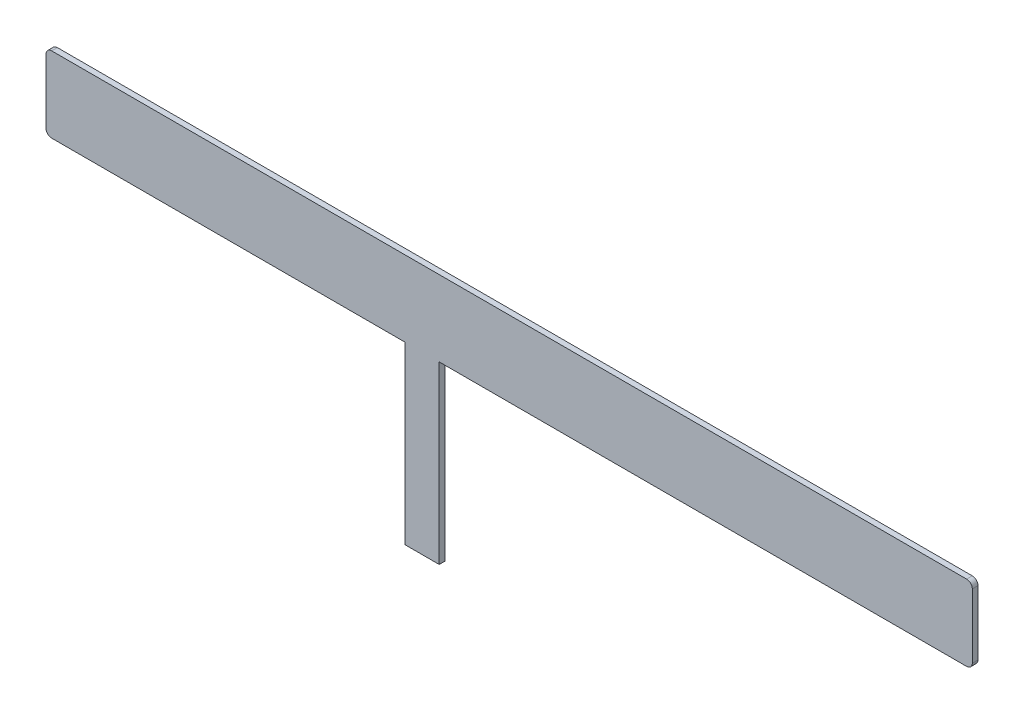
ISO-10303-21;
HEADER;
FILE_DESCRIPTION(('STEP AP214'),'2;1');
FILE_NAME('part.step','',(''),(''),'','','');
FILE_SCHEMA(('AUTOMOTIVE_DESIGN { 1 0 10303 214 1 1 1 1 }'));
ENDSEC;
DATA;
#1=APPLICATION_CONTEXT('core data for automotive mechanical design processes');
#2=APPLICATION_PROTOCOL_DEFINITION('international standard','automotive_design',2000,#1);
#3=PRODUCT_CONTEXT('',#1,'mechanical');
#4=PRODUCT('Part','Part','',(#3));
#5=PRODUCT_RELATED_PRODUCT_CATEGORY('part','',(#4));
#6=PRODUCT_DEFINITION_FORMATION('','',#4);
#7=PRODUCT_DEFINITION_CONTEXT('part definition',#1,'design');
#8=PRODUCT_DEFINITION('design','',#6,#7);
#9=PRODUCT_DEFINITION_SHAPE('','',#8);
#10=(LENGTH_UNIT() NAMED_UNIT(*) SI_UNIT(.MILLI.,.METRE.));
#11=(NAMED_UNIT(*) PLANE_ANGLE_UNIT() SI_UNIT($,.RADIAN.));
#12=(NAMED_UNIT(*) SI_UNIT($,.STERADIAN.) SOLID_ANGLE_UNIT());
#13=UNCERTAINTY_MEASURE_WITH_UNIT(LENGTH_MEASURE(1.E-05),#10,'distance_accuracy_value','');
#14=(GEOMETRIC_REPRESENTATION_CONTEXT(3) GLOBAL_UNCERTAINTY_ASSIGNED_CONTEXT((#13)) GLOBAL_UNIT_ASSIGNED_CONTEXT((#10,
#11,#12)) REPRESENTATION_CONTEXT('',''));
#15=CARTESIAN_POINT('',(0.,0.,0.));
#16=DIRECTION('',(0.,0.,1.));
#17=DIRECTION('',(1.,0.,0.));
#18=AXIS2_PLACEMENT_3D('',#15,#16,#17);
#19=CARTESIAN_POINT('',(21.8927669385197,5.50878863492785,0.3));
#20=DIRECTION('',(0.,-1.,0.));
#21=DIRECTION('',(1.,0.,0.));
#22=AXIS2_PLACEMENT_3D('',#19,#20,#21);
#23=PLANE('',#22);
#24=DIRECTION('',(-1.,0.,0.));
#25=VECTOR('',#24,1.);
#26=CARTESIAN_POINT('',(21.8927669385197,5.50878863492785,0.));
#27=LINE('',#26,#25);
#28=CARTESIAN_POINT('',(21.5927669385197,5.50878863492785,0.));
#29=VERTEX_POINT('',#28);
#30=CARTESIAN_POINT('',(-6.30723306148035,5.50878863492785,0.));
#31=VERTEX_POINT('',#30);
#32=EDGE_CURVE('E164',#29,#31,#27,.T.);
#33=ORIENTED_EDGE('',*,*,#32,.F.);
#34=DIRECTION('',(0.,0.,-1.));
#35=VECTOR('',#34,1.);
#36=CARTESIAN_POINT('',(21.5927669385197,5.50878863492785,0.3));
#37=LINE('',#36,#35);
#38=CARTESIAN_POINT('',(21.5927669385197,5.50878863492785,0.3));
#39=VERTEX_POINT('',#38);
#40=EDGE_CURVE('E132',#29,#39,#37,.F.);
#41=ORIENTED_EDGE('',*,*,#40,.T.);
#42=DIRECTION('',(-1.,0.,0.));
#43=VECTOR('',#42,1.);
#44=CARTESIAN_POINT('',(21.8927669385197,5.50878863492785,0.3));
#45=LINE('',#44,#43);
#46=CARTESIAN_POINT('',(-6.30723306148035,5.50878863492785,0.3));
#47=VERTEX_POINT('',#46);
#48=EDGE_CURVE('E126',#39,#47,#45,.T.);
#49=ORIENTED_EDGE('',*,*,#48,.T.);
#50=DIRECTION('',(0.,0.,-1.));
#51=VECTOR('',#50,1.);
#52=CARTESIAN_POINT('',(-6.30723306148035,5.50878863492785,0.3));
#53=LINE('',#52,#51);
#54=EDGE_CURVE('E129',#47,#31,#53,.T.);
#55=ORIENTED_EDGE('',*,*,#54,.T.);
#56=EDGE_LOOP('',(#33,#41,#49,#55));
#57=FACE_BOUND('',#56,.T.);
#58=ADVANCED_FACE('F37',(#57),#23,.T.);
#59=CARTESIAN_POINT('',(21.8927669385197,9.50878863492785,0.3));
#60=DIRECTION('',(1.,0.,0.));
#61=DIRECTION('',(0.,0.,-1.));
#62=AXIS2_PLACEMENT_3D('',#59,#60,#61);
#63=PLANE('',#62);
#64=DIRECTION('',(0.,-1.,0.));
#65=VECTOR('',#64,1.);
#66=CARTESIAN_POINT('',(21.8927669385197,9.50878863492785,0.3));
#67=LINE('',#66,#65);
#68=CARTESIAN_POINT('',(21.8927669385197,9.20878863492785,0.3));
#69=VERTEX_POINT('',#68);
#70=CARTESIAN_POINT('',(21.8927669385197,5.80878863492785,0.3));
#71=VERTEX_POINT('',#70);
#72=EDGE_CURVE('E144',#69,#71,#67,.T.);
#73=ORIENTED_EDGE('',*,*,#72,.T.);
#74=DIRECTION('',(0.,0.,-1.));
#75=VECTOR('',#74,1.);
#76=CARTESIAN_POINT('',(21.8927669385197,5.80878863492785,0.3));
#77=LINE('',#76,#75);
#78=CARTESIAN_POINT('',(21.8927669385197,5.80878863492785,0.));
#79=VERTEX_POINT('',#78);
#80=EDGE_CURVE('E190',#71,#79,#77,.T.);
#81=ORIENTED_EDGE('',*,*,#80,.T.);
#82=DIRECTION('',(0.,-1.,0.));
#83=VECTOR('',#82,1.);
#84=CARTESIAN_POINT('',(21.8927669385197,9.50878863492785,0.));
#85=LINE('',#84,#83);
#86=CARTESIAN_POINT('',(21.8927669385197,9.20878863492785,0.));
#87=VERTEX_POINT('',#86);
#88=EDGE_CURVE('E136',#87,#79,#85,.T.);
#89=ORIENTED_EDGE('',*,*,#88,.F.);
#90=DIRECTION('',(0.,0.,-1.));
#91=VECTOR('',#90,1.);
#92=CARTESIAN_POINT('',(21.8927669385197,9.20878863492785,0.3));
#93=LINE('',#92,#91);
#94=EDGE_CURVE('E184',#87,#69,#93,.F.);
#95=ORIENTED_EDGE('',*,*,#94,.T.);
#96=EDGE_LOOP('',(#73,#81,#89,#95));
#97=FACE_BOUND('',#96,.T.);
#98=ADVANCED_FACE('F246',(#97),#63,.T.);
#99=CARTESIAN_POINT('',(-27.1072330614803,9.50878863492785,0.3));
#100=DIRECTION('',(0.,1.,0.));
#101=DIRECTION('',(-1.,0.,0.));
#102=AXIS2_PLACEMENT_3D('',#99,#100,#101);
#103=PLANE('',#102);
#104=DIRECTION('',(1.,0.,0.));
#105=VECTOR('',#104,1.);
#106=CARTESIAN_POINT('',(-27.1072330614803,9.50878863492785,0.3));
#107=LINE('',#106,#105);
#108=CARTESIAN_POINT('',(-26.8072330614803,9.50878863492785,0.3));
#109=VERTEX_POINT('',#108);
#110=CARTESIAN_POINT('',(21.5927669385197,9.50878863492785,0.3));
#111=VERTEX_POINT('',#110);
#112=EDGE_CURVE('E159',#109,#111,#107,.T.);
#113=ORIENTED_EDGE('',*,*,#112,.T.);
#114=DIRECTION('',(0.,0.,-1.));
#115=VECTOR('',#114,1.);
#116=CARTESIAN_POINT('',(21.5927669385197,9.50878863492785,0.3));
#117=LINE('',#116,#115);
#118=CARTESIAN_POINT('',(21.5927669385197,9.50878863492785,0.));
#119=VERTEX_POINT('',#118);
#120=EDGE_CURVE('E211',#111,#119,#117,.T.);
#121=ORIENTED_EDGE('',*,*,#120,.T.);
#122=DIRECTION('',(1.,0.,0.));
#123=VECTOR('',#122,1.);
#124=CARTESIAN_POINT('',(-27.1072330614803,9.50878863492785,0.));
#125=LINE('',#124,#123);
#126=CARTESIAN_POINT('',(-26.8072330614803,9.50878863492785,0.));
#127=VERTEX_POINT('',#126);
#128=EDGE_CURVE('E176',#127,#119,#125,.T.);
#129=ORIENTED_EDGE('',*,*,#128,.F.);
#130=DIRECTION('',(0.,0.,-1.));
#131=VECTOR('',#130,1.);
#132=CARTESIAN_POINT('',(-26.8072330614803,9.50878863492785,0.3));
#133=LINE('',#132,#131);
#134=EDGE_CURVE('E209',#127,#109,#133,.F.);
#135=ORIENTED_EDGE('',*,*,#134,.T.);
#136=EDGE_LOOP('',(#113,#121,#129,#135));
#137=FACE_BOUND('',#136,.T.);
#138=ADVANCED_FACE('F254',(#137),#103,.T.);
#139=CARTESIAN_POINT('',(-27.1072330614803,9.50878863492785,0.3));
#140=DIRECTION('',(1.,0.,0.));
#141=DIRECTION('',(0.,1.,0.));
#142=AXIS2_PLACEMENT_3D('',#139,#140,#141);
#143=PLANE('',#142);
#144=DIRECTION('',(0.,-1.,0.));
#145=VECTOR('',#144,1.);
#146=CARTESIAN_POINT('',(-27.1072330614803,9.50878863492785,0.));
#147=LINE('',#146,#145);
#148=CARTESIAN_POINT('',(-27.1072330614803,9.20878863492785,0.));
#149=VERTEX_POINT('',#148);
#150=CARTESIAN_POINT('',(-27.1072330614804,5.80878863492785,0.));
#151=VERTEX_POINT('',#150);
#152=EDGE_CURVE('E174',#149,#151,#147,.T.);
#153=ORIENTED_EDGE('',*,*,#152,.T.);
#154=DIRECTION('',(0.,0.,-1.));
#155=VECTOR('',#154,1.);
#156=CARTESIAN_POINT('',(-27.1072330614804,5.80878863492785,0.3));
#157=LINE('',#156,#155);
#158=CARTESIAN_POINT('',(-27.1072330614804,5.80878863492785,0.3));
#159=VERTEX_POINT('',#158);
#160=EDGE_CURVE('E11',#151,#159,#157,.F.);
#161=ORIENTED_EDGE('',*,*,#160,.T.);
#162=DIRECTION('',(0.,-1.,0.));
#163=VECTOR('',#162,1.);
#164=CARTESIAN_POINT('',(-27.1072330614803,9.50878863492785,0.3));
#165=LINE('',#164,#163);
#166=CARTESIAN_POINT('',(-27.1072330614803,9.20878863492785,0.3));
#167=VERTEX_POINT('',#166);
#168=EDGE_CURVE('E157',#167,#159,#165,.T.);
#169=ORIENTED_EDGE('',*,*,#168,.F.);
#170=DIRECTION('',(0.,0.,-1.));
#171=VECTOR('',#170,1.);
#172=CARTESIAN_POINT('',(-27.1072330614803,9.20878863492785,0.));
#173=LINE('',#172,#171);
#174=EDGE_CURVE('E45',#167,#149,#173,.T.);
#175=ORIENTED_EDGE('',*,*,#174,.T.);
#176=EDGE_LOOP('',(#153,#161,#169,#175));
#177=FACE_BOUND('',#176,.T.);
#178=ADVANCED_FACE('F219',(#177),#143,.F.);
#179=CARTESIAN_POINT('',(-27.1072330614804,5.50878863492785,0.3));
#180=DIRECTION('',(0.,1.,0.));
#181=DIRECTION('',(0.,0.,1.));
#182=AXIS2_PLACEMENT_3D('',#179,#180,#181);
#183=PLANE('',#182);
#184=DIRECTION('',(1.,0.,0.));
#185=VECTOR('',#184,1.);
#186=CARTESIAN_POINT('',(-27.1072330614804,5.50878863492785,0.3));
#187=LINE('',#186,#185);
#188=CARTESIAN_POINT('',(-26.8072330614804,5.50878863492785,0.3));
#189=VERTEX_POINT('',#188);
#190=CARTESIAN_POINT('',(-8.10723306148035,5.50878863492785,0.3));
#191=VERTEX_POINT('',#190);
#192=EDGE_CURVE('E155',#189,#191,#187,.T.);
#193=ORIENTED_EDGE('',*,*,#192,.F.);
#194=DIRECTION('',(0.,0.,-1.));
#195=VECTOR('',#194,1.);
#196=CARTESIAN_POINT('',(-26.8072330614804,5.50878863492785,0.3));
#197=LINE('',#196,#195);
#198=CARTESIAN_POINT('',(-26.8072330614804,5.50878863492785,0.));
#199=VERTEX_POINT('',#198);
#200=EDGE_CURVE('E214',#189,#199,#197,.T.);
#201=ORIENTED_EDGE('',*,*,#200,.T.);
#202=DIRECTION('',(1.,0.,0.));
#203=VECTOR('',#202,1.);
#204=CARTESIAN_POINT('',(-27.1072330614804,5.50878863492785,0.));
#205=LINE('',#204,#203);
#206=CARTESIAN_POINT('',(-8.10723306148035,5.50878863492785,0.));
#207=VERTEX_POINT('',#206);
#208=EDGE_CURVE('E172',#199,#207,#205,.T.);
#209=ORIENTED_EDGE('',*,*,#208,.T.);
#210=DIRECTION('',(0.,0.,-1.));
#211=VECTOR('',#210,1.);
#212=CARTESIAN_POINT('',(-8.10723306148035,5.50878863492785,0.3));
#213=LINE('',#212,#211);
#214=EDGE_CURVE('E181',#191,#207,#213,.T.);
#215=ORIENTED_EDGE('',*,*,#214,.F.);
#216=EDGE_LOOP('',(#193,#201,#209,#215));
#217=FACE_BOUND('',#216,.T.);
#218=ADVANCED_FACE('F231',(#217),#183,.F.);
#219=CARTESIAN_POINT('',(-8.10723306148035,5.50878863492785,0.3));
#220=DIRECTION('',(1.,0.,0.));
#221=DIRECTION('',(0.,0.,-1.));
#222=AXIS2_PLACEMENT_3D('',#219,#220,#221);
#223=PLANE('',#222);
#224=DIRECTION('',(0.,-1.,0.));
#225=VECTOR('',#224,1.);
#226=CARTESIAN_POINT('',(-8.10723306148035,5.50878863492785,0.));
#227=LINE('',#226,#225);
#228=CARTESIAN_POINT('',(-8.10723306148035,-3.77121136507215,0.));
#229=VERTEX_POINT('',#228);
#230=EDGE_CURVE('E170',#207,#229,#227,.T.);
#231=ORIENTED_EDGE('',*,*,#230,.T.);
#232=DIRECTION('',(0.,0.,-1.));
#233=VECTOR('',#232,1.);
#234=CARTESIAN_POINT('',(-8.10723306148035,-3.77121136507215,0.3));
#235=LINE('',#234,#233);
#236=CARTESIAN_POINT('',(-8.10723306148035,-3.77121136507215,0.3));
#237=VERTEX_POINT('',#236);
#238=EDGE_CURVE('E185',#237,#229,#235,.T.);
#239=ORIENTED_EDGE('',*,*,#238,.F.);
#240=DIRECTION('',(0.,-1.,0.));
#241=VECTOR('',#240,1.);
#242=CARTESIAN_POINT('',(-8.10723306148035,5.50878863492785,0.3));
#243=LINE('',#242,#241);
#244=EDGE_CURVE('E151',#191,#237,#243,.T.);
#245=ORIENTED_EDGE('',*,*,#244,.F.);
#246=ORIENTED_EDGE('',*,*,#214,.T.);
#247=EDGE_LOOP('',(#231,#239,#245,#246));
#248=FACE_BOUND('',#247,.T.);
#249=ADVANCED_FACE('F236',(#248),#223,.F.);
#250=CARTESIAN_POINT('',(-8.10723306148035,-3.77121136507215,0.3));
#251=DIRECTION('',(0.,1.,0.));
#252=DIRECTION('',(0.,0.,1.));
#253=AXIS2_PLACEMENT_3D('',#250,#251,#252);
#254=PLANE('',#253);
#255=DIRECTION('',(1.,0.,0.));
#256=VECTOR('',#255,1.);
#257=CARTESIAN_POINT('',(-8.10723306148035,-3.77121136507215,0.));
#258=LINE('',#257,#256);
#259=CARTESIAN_POINT('',(-6.30723306148035,-3.77121136507215,0.));
#260=VERTEX_POINT('',#259);
#261=EDGE_CURVE('E167',#229,#260,#258,.T.);
#262=ORIENTED_EDGE('',*,*,#261,.T.);
#263=DIRECTION('',(0.,0.,-1.));
#264=VECTOR('',#263,1.);
#265=CARTESIAN_POINT('',(-6.30723306148035,-3.77121136507215,0.3));
#266=LINE('',#265,#264);
#267=CARTESIAN_POINT('',(-6.30723306148035,-3.77121136507215,0.3));
#268=VERTEX_POINT('',#267);
#269=EDGE_CURVE('E143',#268,#260,#266,.T.);
#270=ORIENTED_EDGE('',*,*,#269,.F.);
#271=DIRECTION('',(1.,0.,0.));
#272=VECTOR('',#271,1.);
#273=CARTESIAN_POINT('',(-8.10723306148035,-3.77121136507215,0.3));
#274=LINE('',#273,#272);
#275=EDGE_CURVE('E148',#237,#268,#274,.T.);
#276=ORIENTED_EDGE('',*,*,#275,.F.);
#277=ORIENTED_EDGE('',*,*,#238,.T.);
#278=EDGE_LOOP('',(#262,#270,#276,#277));
#279=FACE_BOUND('',#278,.T.);
#280=ADVANCED_FACE('F239',(#279),#254,.F.);
#281=CARTESIAN_POINT('',(-6.30723306148035,5.50878863492785,0.3));
#282=DIRECTION('',(1.,0.,0.));
#283=DIRECTION('',(0.,1.,0.));
#284=AXIS2_PLACEMENT_3D('',#281,#282,#283);
#285=PLANE('',#284);
#286=DIRECTION('',(0.,-1.,0.));
#287=VECTOR('',#286,1.);
#288=CARTESIAN_POINT('',(-6.30723306148035,5.50878863492785,0.));
#289=LINE('',#288,#287);
#290=EDGE_CURVE('E142',#31,#260,#289,.T.);
#291=ORIENTED_EDGE('',*,*,#290,.F.);
#292=ORIENTED_EDGE('',*,*,#54,.F.);
#293=DIRECTION('',(0.,-1.,0.));
#294=VECTOR('',#293,1.);
#295=CARTESIAN_POINT('',(-6.30723306148035,5.50878863492785,0.3));
#296=LINE('',#295,#294);
#297=EDGE_CURVE('E135',#47,#268,#296,.T.);
#298=ORIENTED_EDGE('',*,*,#297,.T.);
#299=ORIENTED_EDGE('',*,*,#269,.T.);
#300=EDGE_LOOP('',(#291,#292,#298,#299));
#301=FACE_BOUND('',#300,.T.);
#302=ADVANCED_FACE('F140',(#301),#285,.T.);
#303=CARTESIAN_POINT('',(0.,0.,0.3));
#304=DIRECTION('',(0.,0.,1.));
#305=DIRECTION('',(1.,0.,0.));
#306=AXIS2_PLACEMENT_3D('',#303,#304,#305);
#307=PLANE('',#306);
#308=ORIENTED_EDGE('',*,*,#48,.F.);
#309=CARTESIAN_POINT('',(21.5927669385197,5.80878863492785,0.3));
#310=DIRECTION('',(0.,0.,1.));
#311=DIRECTION('',(1.,0.,0.));
#312=AXIS2_PLACEMENT_3D('',#309,#310,#311);
#313=CIRCLE('',#312,0.3);
#314=EDGE_CURVE('E207',#39,#71,#313,.T.);
#315=ORIENTED_EDGE('',*,*,#314,.T.);
#316=ORIENTED_EDGE('',*,*,#72,.F.);
#317=CARTESIAN_POINT('',(21.5927669385197,9.20878863492785,0.3));
#318=DIRECTION('',(0.,0.,1.));
#319=DIRECTION('',(1.,0.,0.));
#320=AXIS2_PLACEMENT_3D('',#317,#318,#319);
#321=CIRCLE('',#320,0.3);
#322=EDGE_CURVE('E205',#69,#111,#321,.T.);
#323=ORIENTED_EDGE('',*,*,#322,.T.);
#324=ORIENTED_EDGE('',*,*,#112,.F.);
#325=CARTESIAN_POINT('',(-26.8072330614803,9.20878863492785,0.3));
#326=DIRECTION('',(0.,0.,1.));
#327=DIRECTION('',(1.,0.,0.));
#328=AXIS2_PLACEMENT_3D('',#325,#326,#327);
#329=CIRCLE('',#328,0.3);
#330=EDGE_CURVE('E202',#109,#167,#329,.T.);
#331=ORIENTED_EDGE('',*,*,#330,.T.);
#332=ORIENTED_EDGE('',*,*,#168,.T.);
#333=CARTESIAN_POINT('',(-26.8072330614804,5.80878863492785,0.3));
#334=DIRECTION('',(0.,0.,1.));
#335=DIRECTION('',(1.,0.,0.));
#336=AXIS2_PLACEMENT_3D('',#333,#334,#335);
#337=CIRCLE('',#336,0.3);
#338=EDGE_CURVE('E52',#159,#189,#337,.T.);
#339=ORIENTED_EDGE('',*,*,#338,.T.);
#340=ORIENTED_EDGE('',*,*,#192,.T.);
#341=ORIENTED_EDGE('',*,*,#244,.T.);
#342=ORIENTED_EDGE('',*,*,#275,.T.);
#343=ORIENTED_EDGE('',*,*,#297,.F.);
#344=EDGE_LOOP('',(#308,#315,#316,#323,#324,#331,#332,#339,#340,#341,#342,#343));
#345=FACE_BOUND('',#344,.T.);
#346=ADVANCED_FACE('F146',(#345),#307,.T.);
#347=CARTESIAN_POINT('',(0.,0.,0.));
#348=DIRECTION('',(0.,0.,1.));
#349=DIRECTION('',(1.,0.,0.));
#350=AXIS2_PLACEMENT_3D('',#347,#348,#349);
#351=PLANE('',#350);
#352=ORIENTED_EDGE('',*,*,#88,.T.);
#353=CARTESIAN_POINT('',(21.5927669385197,5.80878863492785,0.));
#354=DIRECTION('',(0.,0.,1.));
#355=DIRECTION('',(1.,0.,0.));
#356=AXIS2_PLACEMENT_3D('',#353,#354,#355);
#357=CIRCLE('',#356,0.3);
#358=EDGE_CURVE('E199',#79,#29,#357,.F.);
#359=ORIENTED_EDGE('',*,*,#358,.T.);
#360=ORIENTED_EDGE('',*,*,#32,.T.);
#361=ORIENTED_EDGE('',*,*,#290,.T.);
#362=ORIENTED_EDGE('',*,*,#261,.F.);
#363=ORIENTED_EDGE('',*,*,#230,.F.);
#364=ORIENTED_EDGE('',*,*,#208,.F.);
#365=CARTESIAN_POINT('',(-26.8072330614804,5.80878863492785,0.));
#366=DIRECTION('',(0.,0.,1.));
#367=DIRECTION('',(1.,0.,0.));
#368=AXIS2_PLACEMENT_3D('',#365,#366,#367);
#369=CIRCLE('',#368,0.3);
#370=EDGE_CURVE('E195',#199,#151,#369,.F.);
#371=ORIENTED_EDGE('',*,*,#370,.T.);
#372=ORIENTED_EDGE('',*,*,#152,.F.);
#373=CARTESIAN_POINT('',(-26.8072330614803,9.20878863492785,0.));
#374=DIRECTION('',(0.,0.,1.));
#375=DIRECTION('',(1.,0.,0.));
#376=AXIS2_PLACEMENT_3D('',#373,#374,#375);
#377=CIRCLE('',#376,0.3);
#378=EDGE_CURVE('E193',#149,#127,#377,.F.);
#379=ORIENTED_EDGE('',*,*,#378,.T.);
#380=ORIENTED_EDGE('',*,*,#128,.T.);
#381=CARTESIAN_POINT('',(21.5927669385197,9.20878863492785,0.));
#382=DIRECTION('',(0.,0.,1.));
#383=DIRECTION('',(1.,0.,0.));
#384=AXIS2_PLACEMENT_3D('',#381,#382,#383);
#385=CIRCLE('',#384,0.3);
#386=EDGE_CURVE('E197',#119,#87,#385,.F.);
#387=ORIENTED_EDGE('',*,*,#386,.T.);
#388=EDGE_LOOP('',(#352,#359,#360,#361,#362,#363,#364,#371,#372,#379,#380,#387));
#389=FACE_BOUND('',#388,.T.);
#390=ADVANCED_FACE('F223',(#389),#351,.F.);
#391=CARTESIAN_POINT('',(21.5927669385197,5.80878863492785,0.3));
#392=DIRECTION('',(0.,0.,-1.));
#393=DIRECTION('',(-1.,0.,0.));
#394=AXIS2_PLACEMENT_3D('',#391,#392,#393);
#395=CYLINDRICAL_SURFACE('',#394,0.3);
#396=ORIENTED_EDGE('',*,*,#314,.F.);
#397=ORIENTED_EDGE('',*,*,#40,.F.);
#398=ORIENTED_EDGE('',*,*,#358,.F.);
#399=ORIENTED_EDGE('',*,*,#80,.F.);
#400=EDGE_LOOP('',(#396,#397,#398,#399));
#401=FACE_BOUND('',#400,.T.);
#402=ADVANCED_FACE('F241',(#401),#395,.T.);
#403=CARTESIAN_POINT('',(21.5927669385197,9.20878863492785,0.3));
#404=DIRECTION('',(0.,0.,-1.));
#405=DIRECTION('',(-1.,0.,0.));
#406=AXIS2_PLACEMENT_3D('',#403,#404,#405);
#407=CYLINDRICAL_SURFACE('',#406,0.3);
#408=ORIENTED_EDGE('',*,*,#322,.F.);
#409=ORIENTED_EDGE('',*,*,#94,.F.);
#410=ORIENTED_EDGE('',*,*,#386,.F.);
#411=ORIENTED_EDGE('',*,*,#120,.F.);
#412=EDGE_LOOP('',(#408,#409,#410,#411));
#413=FACE_BOUND('',#412,.T.);
#414=ADVANCED_FACE('F250',(#413),#407,.T.);
#415=CARTESIAN_POINT('',(-26.8072330614804,5.80878863492785,0.3));
#416=DIRECTION('',(0.,0.,-1.));
#417=DIRECTION('',(-1.,0.,0.));
#418=AXIS2_PLACEMENT_3D('',#415,#416,#417);
#419=CYLINDRICAL_SURFACE('',#418,0.3);
#420=ORIENTED_EDGE('',*,*,#338,.F.);
#421=ORIENTED_EDGE('',*,*,#160,.F.);
#422=ORIENTED_EDGE('',*,*,#370,.F.);
#423=ORIENTED_EDGE('',*,*,#200,.F.);
#424=EDGE_LOOP('',(#420,#421,#422,#423));
#425=FACE_BOUND('',#424,.T.);
#426=ADVANCED_FACE('F229',(#425),#419,.T.);
#427=CARTESIAN_POINT('',(-26.8072330614803,9.20878863492785,0.3));
#428=DIRECTION('',(0.,0.,1.));
#429=DIRECTION('',(1.,0.,0.));
#430=AXIS2_PLACEMENT_3D('',#427,#428,#429);
#431=CYLINDRICAL_SURFACE('',#430,0.3);
#432=ORIENTED_EDGE('',*,*,#330,.F.);
#433=ORIENTED_EDGE('',*,*,#134,.F.);
#434=ORIENTED_EDGE('',*,*,#378,.F.);
#435=ORIENTED_EDGE('',*,*,#174,.F.);
#436=EDGE_LOOP('',(#432,#433,#434,#435));
#437=FACE_BOUND('',#436,.T.);
#438=ADVANCED_FACE('F39',(#437),#431,.T.);
#439=CLOSED_SHELL('',(#58,#98,#138,#178,#218,#249,#280,#302,#346,#390,#402,#414,#426,#438));
#440=MANIFOLD_SOLID_BREP('B2',#439);
#441=ADVANCED_BREP_SHAPE_REPRESENTATION('',(#18,#440),#14);
#442=SHAPE_DEFINITION_REPRESENTATION(#9,#441);
ENDSEC;
END-ISO-10303-21;
